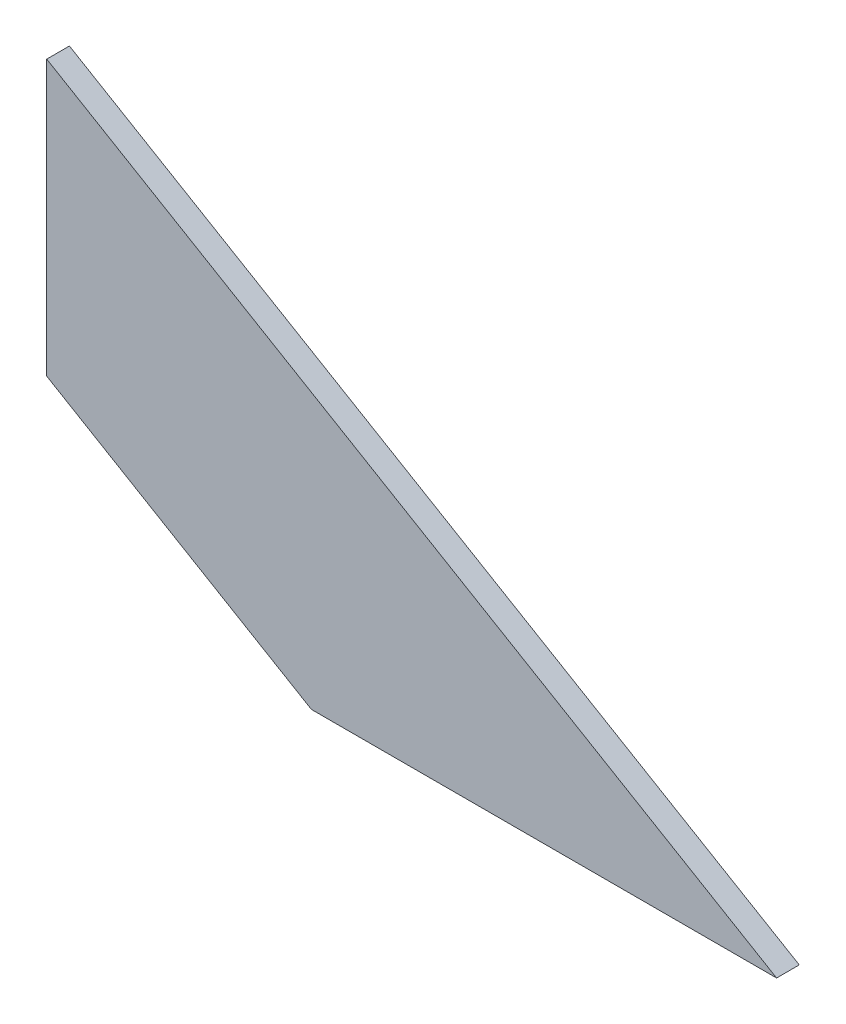
ISO-10303-21;
HEADER;
FILE_DESCRIPTION(('STEP AP214'),'2;1');
FILE_NAME('part.step','',(''),(''),'','','');
FILE_SCHEMA(('AUTOMOTIVE_DESIGN { 1 0 10303 214 1 1 1 1 }'));
ENDSEC;
DATA;
#1=APPLICATION_CONTEXT('core data for automotive mechanical design processes');
#2=APPLICATION_PROTOCOL_DEFINITION('international standard','automotive_design',2000,#1);
#3=PRODUCT_CONTEXT('',#1,'mechanical');
#4=PRODUCT('Part','Part','',(#3));
#5=PRODUCT_RELATED_PRODUCT_CATEGORY('part','',(#4));
#6=PRODUCT_DEFINITION_FORMATION('','',#4);
#7=PRODUCT_DEFINITION_CONTEXT('part definition',#1,'design');
#8=PRODUCT_DEFINITION('design','',#6,#7);
#9=PRODUCT_DEFINITION_SHAPE('','',#8);
#10=(LENGTH_UNIT() NAMED_UNIT(*) SI_UNIT(.MILLI.,.METRE.));
#11=(NAMED_UNIT(*) PLANE_ANGLE_UNIT() SI_UNIT($,.RADIAN.));
#12=(NAMED_UNIT(*) SI_UNIT($,.STERADIAN.) SOLID_ANGLE_UNIT());
#13=UNCERTAINTY_MEASURE_WITH_UNIT(LENGTH_MEASURE(1.E-05),#10,'distance_accuracy_value','');
#14=(GEOMETRIC_REPRESENTATION_CONTEXT(3) GLOBAL_UNCERTAINTY_ASSIGNED_CONTEXT((#13)) GLOBAL_UNIT_ASSIGNED_CONTEXT((#10,
#11,#12)) REPRESENTATION_CONTEXT('',''));
#15=CARTESIAN_POINT('',(0.,0.,0.));
#16=DIRECTION('',(0.,0.,1.));
#17=DIRECTION('',(1.,0.,0.));
#18=AXIS2_PLACEMENT_3D('',#15,#16,#17);
#19=CARTESIAN_POINT('',(152.098334086616,193.046078464214,2.));
#20=DIRECTION('',(0.508374144491781,0.861136301181323,0.));
#21=DIRECTION('',(-0.861136301181323,0.508374144491781,0.));
#22=AXIS2_PLACEMENT_3D('',#19,#20,#21);
#23=PLANE('',#22);
#24=DIRECTION('',(0.861136301181323,-0.508374144491781,0.));
#25=VECTOR('',#24,1.);
#26=CARTESIAN_POINT('',(152.098334086616,193.046078464214,0.));
#27=LINE('',#26,#25);
#28=CARTESIAN_POINT('',(128.754910615074,206.826931646892,0.));
#29=VERTEX_POINT('',#28);
#30=CARTESIAN_POINT('',(152.098334086616,193.046078464214,0.));
#31=VERTEX_POINT('',#30);
#32=EDGE_CURVE('E107',#29,#31,#27,.T.);
#33=ORIENTED_EDGE('',*,*,#32,.T.);
#34=DIRECTION('',(0.,0.,-1.));
#35=VECTOR('',#34,1.);
#36=CARTESIAN_POINT('',(152.098334086616,193.046078464214,2.));
#37=LINE('',#36,#35);
#38=CARTESIAN_POINT('',(152.098334086616,193.046078464214,2.));
#39=VERTEX_POINT('',#38);
#40=EDGE_CURVE('E11',#39,#31,#37,.T.);
#41=ORIENTED_EDGE('',*,*,#40,.F.);
#42=DIRECTION('',(0.861136301181323,-0.508374144491781,0.));
#43=VECTOR('',#42,1.);
#44=CARTESIAN_POINT('',(152.098334086616,193.046078464214,2.));
#45=LINE('',#44,#43);
#46=CARTESIAN_POINT('',(128.754910615074,206.826931646892,2.));
#47=VERTEX_POINT('',#46);
#48=EDGE_CURVE('E91',#47,#39,#45,.T.);
#49=ORIENTED_EDGE('',*,*,#48,.F.);
#50=DIRECTION('',(0.,0.,-1.));
#51=VECTOR('',#50,1.);
#52=CARTESIAN_POINT('',(128.754910615074,206.826931646892,2.));
#53=LINE('',#52,#51);
#54=EDGE_CURVE('E103',#47,#29,#53,.T.);
#55=ORIENTED_EDGE('',*,*,#54,.T.);
#56=EDGE_LOOP('',(#33,#41,#49,#55));
#57=FACE_BOUND('',#56,.T.);
#58=ADVANCED_FACE('F39',(#57),#23,.F.);
#59=CARTESIAN_POINT('',(193.123210615074,193.046078464214,2.));
#60=DIRECTION('',(0.,1.,0.));
#61=DIRECTION('',(-1.,0.,0.));
#62=AXIS2_PLACEMENT_3D('',#59,#60,#61);
#63=PLANE('',#62);
#64=DIRECTION('',(1.,0.,0.));
#65=VECTOR('',#64,1.);
#66=CARTESIAN_POINT('',(193.123210615074,193.046078464214,0.));
#67=LINE('',#66,#65);
#68=CARTESIAN_POINT('',(193.123210615074,193.046078464214,0.));
#69=VERTEX_POINT('',#68);
#70=EDGE_CURVE('E96',#31,#69,#67,.T.);
#71=ORIENTED_EDGE('',*,*,#70,.T.);
#72=DIRECTION('',(0.,0.,-1.));
#73=VECTOR('',#72,1.);
#74=CARTESIAN_POINT('',(193.123210615074,193.046078464214,2.));
#75=LINE('',#74,#73);
#76=CARTESIAN_POINT('',(193.123210615074,193.046078464214,2.));
#77=VERTEX_POINT('',#76);
#78=EDGE_CURVE('E48',#77,#69,#75,.T.);
#79=ORIENTED_EDGE('',*,*,#78,.F.);
#80=DIRECTION('',(1.,0.,0.));
#81=VECTOR('',#80,1.);
#82=CARTESIAN_POINT('',(193.123210615074,193.046078464214,2.));
#83=LINE('',#82,#81);
#84=EDGE_CURVE('E86',#39,#77,#83,.T.);
#85=ORIENTED_EDGE('',*,*,#84,.F.);
#86=ORIENTED_EDGE('',*,*,#40,.T.);
#87=EDGE_LOOP('',(#71,#79,#85,#86));
#88=FACE_BOUND('',#87,.T.);
#89=ADVANCED_FACE('F95',(#88),#63,.F.);
#90=CARTESIAN_POINT('',(128.754910615074,231.046078464214,2.));
#91=DIRECTION('',(-0.508374144491782,-0.861136301181322,0.));
#92=DIRECTION('',(0.861136301181322,-0.508374144491782,0.));
#93=AXIS2_PLACEMENT_3D('',#90,#91,#92);
#94=PLANE('',#93);
#95=DIRECTION('',(-0.861136301181322,0.508374144491782,0.));
#96=VECTOR('',#95,1.);
#97=CARTESIAN_POINT('',(128.754910615074,231.046078464214,0.));
#98=LINE('',#97,#96);
#99=CARTESIAN_POINT('',(128.754910615074,231.046078464214,0.));
#100=VERTEX_POINT('',#99);
#101=EDGE_CURVE('E73',#69,#100,#98,.T.);
#102=ORIENTED_EDGE('',*,*,#101,.T.);
#103=DIRECTION('',(0.,0.,-1.));
#104=VECTOR('',#103,1.);
#105=CARTESIAN_POINT('',(128.754910615074,231.046078464214,2.));
#106=LINE('',#105,#104);
#107=CARTESIAN_POINT('',(128.754910615074,231.046078464214,2.));
#108=VERTEX_POINT('',#107);
#109=EDGE_CURVE('E98',#108,#100,#106,.T.);
#110=ORIENTED_EDGE('',*,*,#109,.F.);
#111=DIRECTION('',(-0.861136301181322,0.508374144491782,0.));
#112=VECTOR('',#111,1.);
#113=CARTESIAN_POINT('',(128.754910615074,231.046078464214,2.));
#114=LINE('',#113,#112);
#115=EDGE_CURVE('E89',#77,#108,#114,.T.);
#116=ORIENTED_EDGE('',*,*,#115,.F.);
#117=ORIENTED_EDGE('',*,*,#78,.T.);
#118=EDGE_LOOP('',(#102,#110,#116,#117));
#119=FACE_BOUND('',#118,.T.);
#120=ADVANCED_FACE('F99',(#119),#94,.F.);
#121=CARTESIAN_POINT('',(128.754910615074,206.826931646892,2.));
#122=DIRECTION('',(1.,0.,0.));
#123=DIRECTION('',(0.,0.,-1.));
#124=AXIS2_PLACEMENT_3D('',#121,#122,#123);
#125=PLANE('',#124);
#126=DIRECTION('',(0.,-1.,0.));
#127=VECTOR('',#126,1.);
#128=CARTESIAN_POINT('',(128.754910615074,206.826931646892,0.));
#129=LINE('',#128,#127);
#130=EDGE_CURVE('E79',#100,#29,#129,.T.);
#131=ORIENTED_EDGE('',*,*,#130,.T.);
#132=ORIENTED_EDGE('',*,*,#54,.F.);
#133=DIRECTION('',(0.,-1.,0.));
#134=VECTOR('',#133,1.);
#135=CARTESIAN_POINT('',(128.754910615074,206.826931646892,2.));
#136=LINE('',#135,#134);
#137=EDGE_CURVE('E56',#108,#47,#136,.T.);
#138=ORIENTED_EDGE('',*,*,#137,.F.);
#139=ORIENTED_EDGE('',*,*,#109,.T.);
#140=EDGE_LOOP('',(#131,#132,#138,#139));
#141=FACE_BOUND('',#140,.T.);
#142=ADVANCED_FACE('F120',(#141),#125,.F.);
#143=CARTESIAN_POINT('',(0.,0.,2.));
#144=DIRECTION('',(0.,0.,-1.));
#145=DIRECTION('',(-1.,0.,0.));
#146=AXIS2_PLACEMENT_3D('',#143,#144,#145);
#147=PLANE('',#146);
#148=ORIENTED_EDGE('',*,*,#48,.T.);
#149=ORIENTED_EDGE('',*,*,#84,.T.);
#150=ORIENTED_EDGE('',*,*,#115,.T.);
#151=ORIENTED_EDGE('',*,*,#137,.T.);
#152=EDGE_LOOP('',(#148,#149,#150,#151));
#153=FACE_BOUND('',#152,.T.);
#154=ADVANCED_FACE('F87',(#153),#147,.F.);
#155=CARTESIAN_POINT('',(0.,0.,0.));
#156=DIRECTION('',(0.,0.,-1.));
#157=DIRECTION('',(-1.,0.,0.));
#158=AXIS2_PLACEMENT_3D('',#155,#156,#157);
#159=PLANE('',#158);
#160=ORIENTED_EDGE('',*,*,#32,.F.);
#161=ORIENTED_EDGE('',*,*,#130,.F.);
#162=ORIENTED_EDGE('',*,*,#101,.F.);
#163=ORIENTED_EDGE('',*,*,#70,.F.);
#164=EDGE_LOOP('',(#160,#161,#162,#163));
#165=FACE_BOUND('',#164,.T.);
#166=ADVANCED_FACE('F123',(#165),#159,.T.);
#167=CLOSED_SHELL('',(#58,#89,#120,#142,#154,#166));
#168=MANIFOLD_SOLID_BREP('B2',#167);
#169=ADVANCED_BREP_SHAPE_REPRESENTATION('',(#18,#168),#14);
#170=SHAPE_DEFINITION_REPRESENTATION(#9,#169);
ENDSEC;
END-ISO-10303-21;
